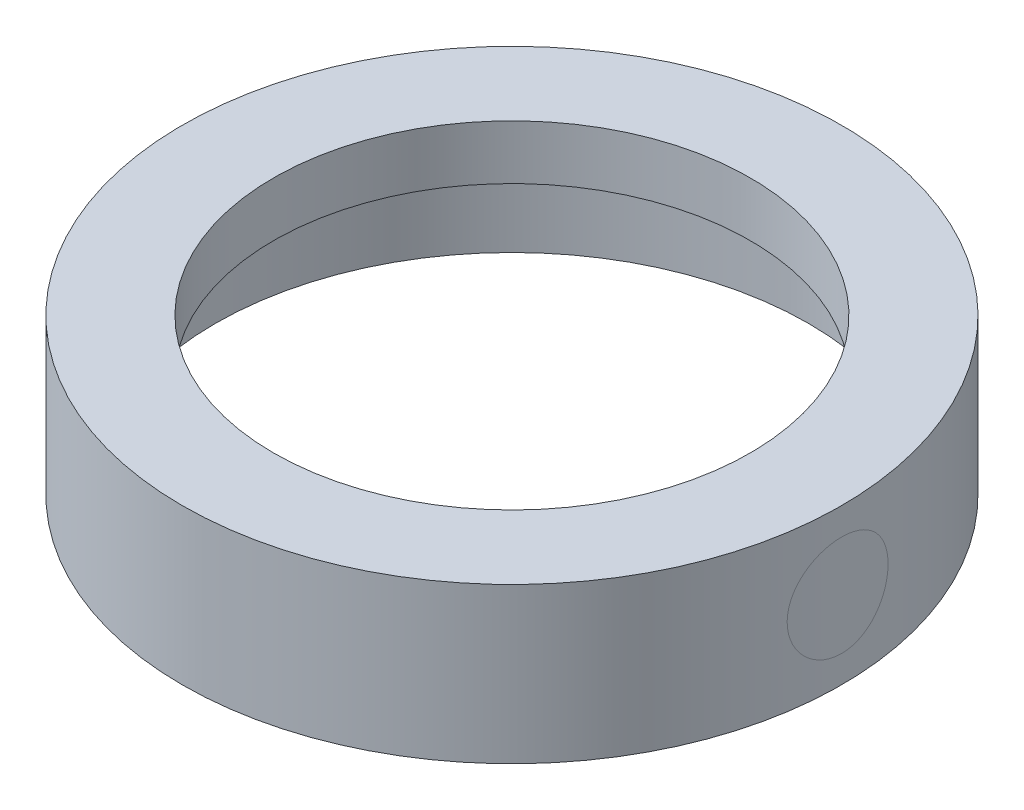
ISO-10303-21;
HEADER;
FILE_DESCRIPTION(('STEP AP214'),'2;1');
FILE_NAME('part.step','',(''),(''),'','','');
FILE_SCHEMA(('AUTOMOTIVE_DESIGN { 1 0 10303 214 1 1 1 1 }'));
ENDSEC;
DATA;
#1=APPLICATION_CONTEXT('core data for automotive mechanical design processes');
#2=APPLICATION_PROTOCOL_DEFINITION('international standard','automotive_design',2000,#1);
#3=PRODUCT_CONTEXT('',#1,'mechanical');
#4=PRODUCT('Part','Part','',(#3));
#5=PRODUCT_RELATED_PRODUCT_CATEGORY('part','',(#4));
#6=PRODUCT_DEFINITION_FORMATION('','',#4);
#7=PRODUCT_DEFINITION_CONTEXT('part definition',#1,'design');
#8=PRODUCT_DEFINITION('design','',#6,#7);
#9=PRODUCT_DEFINITION_SHAPE('','',#8);
#10=(LENGTH_UNIT() NAMED_UNIT(*) SI_UNIT(.MILLI.,.METRE.));
#11=(NAMED_UNIT(*) PLANE_ANGLE_UNIT() SI_UNIT($,.RADIAN.));
#12=(NAMED_UNIT(*) SI_UNIT($,.STERADIAN.) SOLID_ANGLE_UNIT());
#13=UNCERTAINTY_MEASURE_WITH_UNIT(LENGTH_MEASURE(1.E-05),#10,'distance_accuracy_value','');
#14=(GEOMETRIC_REPRESENTATION_CONTEXT(3) GLOBAL_UNCERTAINTY_ASSIGNED_CONTEXT((#13)) GLOBAL_UNIT_ASSIGNED_CONTEXT((#10,
#11,#12)) REPRESENTATION_CONTEXT('',''));
#15=CARTESIAN_POINT('',(0.,0.,0.));
#16=DIRECTION('',(0.,0.,1.));
#17=DIRECTION('',(1.,0.,0.));
#18=AXIS2_PLACEMENT_3D('',#15,#16,#17);
#19=CARTESIAN_POINT('',(0.,3.98145,0.));
#20=DIRECTION('',(0.,1.,0.));
#21=DIRECTION('',(0.,0.,1.));
#22=AXIS2_PLACEMENT_3D('',#19,#20,#21);
#23=CYLINDRICAL_SURFACE('',#22,15.367);
#24=CARTESIAN_POINT('',(15.185835813164,0.,-2.352675));
#25=CARTESIAN_POINT('',(15.1858380429769,-0.131317226519423,-2.35266960067987));
#26=CARTESIAN_POINT('',(15.1875575679045,-0.262709877258928,-2.34164338166575));
#27=CARTESIAN_POINT('',(15.1942449338306,-0.521819256900588,-2.29784287316508));
#28=CARTESIAN_POINT('',(15.1992159123367,-0.649532310752176,-2.26504757703732));
#29=CARTESIAN_POINT('',(15.2118302638676,-0.897494564668533,-2.17871507273392));
#30=CARTESIAN_POINT('',(15.2194715530552,-1.01774949893183,-2.12519403484746));
#31=CARTESIAN_POINT('',(15.2365630739185,-1.24755573741111,-1.99896779610506));
#32=CARTESIAN_POINT('',(15.2460130646509,-1.35710846437135,-1.92626515000783));
#33=CARTESIAN_POINT('',(15.2657452737289,-1.56332992259744,-1.76309240744842));
#34=CARTESIAN_POINT('',(15.2760331714406,-1.65989650851769,-1.67249388772129));
#35=CARTESIAN_POINT('',(15.2962313606782,-1.83651897527497,-1.47637851161808));
#36=CARTESIAN_POINT('',(15.306141631135,-1.91657393596616,-1.3708608243913));
#37=CARTESIAN_POINT('',(15.324527493462,-2.05827875844475,-1.14724661934941));
#38=CARTESIAN_POINT('',(15.3329956466582,-2.11983437393442,-1.02908971368307));
#39=CARTESIAN_POINT('',(15.347480185442,-2.22218818486969,-0.783962608125336));
#40=CARTESIAN_POINT('',(15.3534967058709,-2.26298752195318,-0.656992893393158));
#41=CARTESIAN_POINT('',(15.3623600090171,-2.3223604785304,-0.398896976207315));
#42=CARTESIAN_POINT('',(15.3652311895685,-2.34110525661952,-0.267810998880129));
#43=CARTESIAN_POINT('',(15.3675639644876,-2.35636859675936,-0.0043250324476952));
#44=CARTESIAN_POINT('',(15.3670257559293,-2.35288844348532,0.128074880265991));
#45=CARTESIAN_POINT('',(15.3626198559888,-2.32393549774011,0.389262175451393));
#46=CARTESIAN_POINT('',(15.3587800441123,-2.29864685592987,0.518070508404816));
#47=CARTESIAN_POINT('',(15.348233441568,-2.22708400545943,0.769593575449626));
#48=CARTESIAN_POINT('',(15.3415265746233,-2.18080923846976,0.892308147321979));
#49=CARTESIAN_POINT('',(15.3259516076668,-2.06840017244275,1.128715918618));
#50=CARTESIAN_POINT('',(15.3170751287562,-2.00218864334317,1.24237182158406));
#51=CARTESIAN_POINT('',(15.2981496686596,-1.85184197548449,1.45702933644741));
#52=CARTESIAN_POINT('',(15.2881006071443,-1.76770560843274,1.55803008040116));
#53=CARTESIAN_POINT('',(15.2678286164191,-1.58287252151248,1.74559619851173));
#54=CARTESIAN_POINT('',(15.2576049606436,-1.48201499071502,1.83200310232341));
#55=CARTESIAN_POINT('',(15.2382363145809,-1.26714809881561,1.98669051325555));
#56=CARTESIAN_POINT('',(15.2290913314733,-1.15313865018478,2.0549708997301));
#57=CARTESIAN_POINT('',(15.2129155455708,-0.915035738541728,2.17149018842521));
#58=CARTESIAN_POINT('',(15.2058865148852,-0.790933933043619,2.21971230468349));
#59=CARTESIAN_POINT('',(15.19476945959,-0.536260954206485,2.29458413598097));
#60=CARTESIAN_POINT('',(15.1906812185996,-0.405690257598812,2.32123543820057));
#61=CARTESIAN_POINT('',(15.1859498169002,-0.143197271314022,2.35199073689715));
#62=CARTESIAN_POINT('',(15.1852722996887,-0.0113019264259799,2.35631959998904));
#63=CARTESIAN_POINT('',(15.1873477890073,0.251330326699999,2.34290427099471));
#64=CARTESIAN_POINT('',(15.1901006844844,0.382067272300802,2.32516079345625));
#65=CARTESIAN_POINT('',(15.1986952239793,0.637971795447607,2.26829535358273));
#66=CARTESIAN_POINT('',(15.2045206142662,0.763164957465435,2.22928585397697));
#67=CARTESIAN_POINT('',(15.2185903219059,1.00523591256296,2.13111286467415));
#68=CARTESIAN_POINT('',(15.2268347632859,1.12211327890134,2.07194834158308));
#69=CARTESIAN_POINT('',(15.2448943749283,1.34524164721115,1.93460620543877));
#70=CARTESIAN_POINT('',(15.2547213430912,1.45140223980099,1.85628329010571));
#71=CARTESIAN_POINT('',(15.2748034076446,1.6491532138721,1.68304920365968));
#72=CARTESIAN_POINT('',(15.2850585292613,1.74074273531177,1.58813705407862));
#73=CARTESIAN_POINT('',(15.3049490145171,1.90756166381185,1.3834273332545));
#74=CARTESIAN_POINT('',(15.3145782133269,1.98264187913811,1.27350749705075));
#75=CARTESIAN_POINT('',(15.3320355593614,2.11327051596323,1.04248479012309));
#76=CARTESIAN_POINT('',(15.3398637575181,2.16881948982558,0.921382235780205));
#77=CARTESIAN_POINT('',(15.352810103632,2.25857153697538,0.671893504627777));
#78=CARTESIAN_POINT('',(15.3579385170057,2.2928555561827,0.543537002874031));
#79=CARTESIAN_POINT('',(15.3649506069629,2.33936623728937,0.282804257714095));
#80=CARTESIAN_POINT('',(15.366834507191,2.35159441950336,0.150428292010259));
#81=CARTESIAN_POINT('',(15.3671429012579,2.35360802079699,-0.113139982287013));
#82=CARTESIAN_POINT('',(15.3656025467778,2.34362148435485,-0.24433056437077));
#83=CARTESIAN_POINT('',(15.3593065446846,2.30197872449315,-0.503143396417296));
#84=CARTESIAN_POINT('',(15.3545509086398,2.27032257903992,-0.630765659217008));
#85=CARTESIAN_POINT('',(15.3423562985326,2.18632130717684,-0.878752112138238));
#86=CARTESIAN_POINT('',(15.3349194568356,2.13399261850357,-0.999121981557647));
#87=CARTESIAN_POINT('',(15.3181783745126,2.01015618109243,-1.22940877870968));
#88=CARTESIAN_POINT('',(15.3088740681948,1.93864775763959,-1.33932533852589));
#89=CARTESIAN_POINT('',(15.2893183668206,1.77765997661353,-1.54674068069667));
#90=CARTESIAN_POINT('',(15.2790586350212,1.68801247905064,-1.64410818567531));
#91=CARTESIAN_POINT('',(15.2588093651368,1.49364504599507,-1.8225002456294));
#92=CARTESIAN_POINT('',(15.2488198909899,1.38892158021562,-1.90352096203305));
#93=CARTESIAN_POINT('',(15.2301791978254,1.16665044172464,-2.04734867885495));
#94=CARTESIAN_POINT('',(15.2215361807831,1.04903108174843,-2.11004594391973));
#95=CARTESIAN_POINT('',(15.2066632813138,0.804852743826474,-2.21470068917086));
#96=CARTESIAN_POINT('',(15.200430912644,0.678303136357985,-2.25667954986252));
#97=CARTESIAN_POINT('',(15.1925146270749,0.459331874061138,-2.30925157592465));
#98=CARTESIAN_POINT('',(15.1900234652318,0.368258147374492,-2.32551023132472));
#99=CARTESIAN_POINT('',(15.1866832849588,0.184802054767488,-2.34722376873507));
#100=CARTESIAN_POINT('',(15.1858342438448,0.0924197069420707,-2.35267879998571));
#101=CARTESIAN_POINT('',(15.185835813164,0.,-2.352675));
#102=B_SPLINE_CURVE_WITH_KNOTS('',3,(#24,#25,#26,#27,#28,#29,#30,#31,#32,#33,#34,#35,#36,#37,
#38,#39,#40,#41,#42,#43,#44,#45,#46,#47,#48,#49,#50,#51,#52,#53,#54,#55,#56,#57,#58,#59,#60,#61,
#62,#63,#64,#65,#66,#67,#68,#69,#70,#71,#72,#73,#74,#75,#76,#77,#78,#79,#80,#81,#82,#83,#84,#85,
#86,#87,#88,#89,#90,#91,#92,#93,#94,#95,#96,#97,#98,#99,#100,#101),.UNSPECIFIED.,.T.,.F.,(4,2,2,
2,2,2,2,2,2,2,2,2,2,2,2,2,2,2,2,2,2,2,2,2,2,2,2,2,2,2,2,2,2,2,2,2,2,2,4),(0.,0.3936138475549,
0.787608076350895,1.18129552692755,1.57493056953332,1.97150033879375,2.36809220179008,
2.76667155504359,3.16522898324421,3.56067249007626,3.95609313916009,4.34820719346334,
4.7403316804535,5.1339951412242,5.52768558631436,5.92540888768973,6.32313483615336,
6.7211929591142,7.11922179029687,7.51323310688259,7.90723166847412,8.29916654956429,
8.6911215290749,9.08614675344485,9.48119528510438,9.87967911790611,10.2781516802707,
10.6750979791437,11.0720169153586,11.4648801153055,11.8577419017547,12.2502919315743,
12.6428557725406,13.0392405077671,13.435718214461,13.834523847672,14.2329170655306,
14.509942250514,14.7869636086676),.UNSPECIFIED.);
#103=CARTESIAN_POINT('',(15.185835813164,0.,-2.352675));
#104=VERTEX_POINT('',#103);
#105=EDGE_CURVE('E10',#104,#104,#102,.T.);
#106=ORIENTED_EDGE('',*,*,#105,.F.);
#107=EDGE_LOOP('',(#106));
#108=FACE_BOUND('',#107,.T.);
#109=ADVANCED_FACE('F36',(#108),#23,.T.);
#110=CARTESIAN_POINT('',(0.,3.6195,-11.1125));
#111=DIRECTION('',(0.,-1.,0.));
#112=DIRECTION('',(0.,0.,-1.));
#113=AXIS2_PLACEMENT_3D('',#110,#111,#112);
#114=PLANE('',#113);
#115=CARTESIAN_POINT('',(0.,3.6195,0.));
#116=DIRECTION('',(0.,1.,0.));
#117=DIRECTION('',(0.,0.,1.));
#118=AXIS2_PLACEMENT_3D('',#115,#116,#117);
#119=CIRCLE('',#118,11.1125);
#120=CARTESIAN_POINT('',(0.,3.6195,11.1125));
#121=VERTEX_POINT('',#120);
#122=EDGE_CURVE('E68',#121,#121,#119,.T.);
#123=ORIENTED_EDGE('',*,*,#122,.F.);
#124=EDGE_LOOP('',(#123));
#125=FACE_BOUND('',#124,.T.);
#126=CARTESIAN_POINT('',(0.,3.6195,0.));
#127=DIRECTION('',(0.,1.,0.));
#128=DIRECTION('',(0.,0.,1.));
#129=AXIS2_PLACEMENT_3D('',#126,#127,#128);
#130=CIRCLE('',#129,15.367);
#131=CARTESIAN_POINT('',(0.,3.6195,15.367));
#132=VERTEX_POINT('',#131);
#133=EDGE_CURVE('E47',#132,#132,#130,.T.);
#134=ORIENTED_EDGE('',*,*,#133,.T.);
#135=EDGE_LOOP('',(#134));
#136=FACE_BOUND('',#135,.T.);
#137=ADVANCED_FACE('F74',(#125,#136),#114,.F.);
#138=ORIENTED_EDGE('',*,*,#105,.T.);
#139=EDGE_LOOP('',(#138));
#140=FACE_BOUND('',#139,.T.);
#141=ORIENTED_EDGE('',*,*,#133,.F.);
#142=EDGE_LOOP('',(#141));
#143=FACE_BOUND('',#142,.T.);
#144=CARTESIAN_POINT('',(0.,-3.6195,0.));
#145=DIRECTION('',(0.,1.,0.));
#146=DIRECTION('',(0.,0.,1.));
#147=AXIS2_PLACEMENT_3D('',#144,#145,#146);
#148=CIRCLE('',#147,15.367);
#149=CARTESIAN_POINT('',(0.,-3.6195,15.367));
#150=VERTEX_POINT('',#149);
#151=EDGE_CURVE('E53',#150,#150,#148,.T.);
#152=ORIENTED_EDGE('',*,*,#151,.T.);
#153=EDGE_LOOP('',(#152));
#154=FACE_BOUND('',#153,.T.);
#155=ADVANCED_FACE('F76',(#140,#143,#154),#23,.T.);
#156=CARTESIAN_POINT('',(0.,-3.6195,-15.367));
#157=DIRECTION('',(0.,1.,0.));
#158=DIRECTION('',(0.,0.,1.));
#159=AXIS2_PLACEMENT_3D('',#156,#157,#158);
#160=PLANE('',#159);
#161=ORIENTED_EDGE('',*,*,#151,.F.);
#162=EDGE_LOOP('',(#161));
#163=FACE_BOUND('',#162,.T.);
#164=CARTESIAN_POINT('',(0.,-3.6195,0.));
#165=DIRECTION('',(0.,1.,0.));
#166=DIRECTION('',(0.,0.,1.));
#167=AXIS2_PLACEMENT_3D('',#164,#165,#166);
#168=CIRCLE('',#167,13.8303);
#169=CARTESIAN_POINT('',(0.,-3.6195,13.8303));
#170=VERTEX_POINT('',#169);
#171=EDGE_CURVE('E57',#170,#170,#168,.T.);
#172=ORIENTED_EDGE('',*,*,#171,.T.);
#173=EDGE_LOOP('',(#172));
#174=FACE_BOUND('',#173,.T.);
#175=ADVANCED_FACE('F82',(#163,#174),#160,.F.);
#176=CARTESIAN_POINT('',(0.,3.98145,0.));
#177=DIRECTION('',(0.,1.,0.));
#178=DIRECTION('',(0.,0.,1.));
#179=AXIS2_PLACEMENT_3D('',#176,#177,#178);
#180=CYLINDRICAL_SURFACE('',#179,13.8303);
#181=ORIENTED_EDGE('',*,*,#171,.F.);
#182=EDGE_LOOP('',(#181));
#183=FACE_BOUND('',#182,.T.);
#184=CARTESIAN_POINT('',(0.,1.08585,0.));
#185=DIRECTION('',(0.,1.,0.));
#186=DIRECTION('',(0.,0.,1.));
#187=AXIS2_PLACEMENT_3D('',#184,#185,#186);
#188=CIRCLE('',#187,13.8303);
#189=CARTESIAN_POINT('',(0.,1.08585,13.8303));
#190=VERTEX_POINT('',#189);
#191=EDGE_CURVE('E62',#190,#190,#188,.T.);
#192=ORIENTED_EDGE('',*,*,#191,.T.);
#193=EDGE_LOOP('',(#192));
#194=FACE_BOUND('',#193,.T.);
#195=ADVANCED_FACE('F88',(#183,#194),#180,.F.);
#196=CARTESIAN_POINT('',(0.,1.08585,-13.8303));
#197=DIRECTION('',(0.,1.,0.));
#198=DIRECTION('',(0.,0.,1.));
#199=AXIS2_PLACEMENT_3D('',#196,#197,#198);
#200=PLANE('',#199);
#201=ORIENTED_EDGE('',*,*,#191,.F.);
#202=EDGE_LOOP('',(#201));
#203=FACE_BOUND('',#202,.T.);
#204=CARTESIAN_POINT('',(0.,1.08585,0.));
#205=DIRECTION('',(0.,1.,0.));
#206=DIRECTION('',(0.,0.,1.));
#207=AXIS2_PLACEMENT_3D('',#204,#205,#206);
#208=CIRCLE('',#207,11.1125);
#209=CARTESIAN_POINT('',(0.,1.08585,11.1125));
#210=VERTEX_POINT('',#209);
#211=EDGE_CURVE('E65',#210,#210,#208,.T.);
#212=ORIENTED_EDGE('',*,*,#211,.T.);
#213=EDGE_LOOP('',(#212));
#214=FACE_BOUND('',#213,.T.);
#215=ADVANCED_FACE('F92',(#203,#214),#200,.F.);
#216=CARTESIAN_POINT('',(0.,3.98145,0.));
#217=DIRECTION('',(0.,1.,0.));
#218=DIRECTION('',(0.,0.,1.));
#219=AXIS2_PLACEMENT_3D('',#216,#217,#218);
#220=CYLINDRICAL_SURFACE('',#219,11.1125);
#221=ORIENTED_EDGE('',*,*,#211,.F.);
#222=EDGE_LOOP('',(#221));
#223=FACE_BOUND('',#222,.T.);
#224=ORIENTED_EDGE('',*,*,#122,.T.);
#225=EDGE_LOOP('',(#224));
#226=FACE_BOUND('',#225,.T.);
#227=ADVANCED_FACE('F72',(#223,#226),#220,.F.);
#228=CLOSED_SHELL('',(#109,#137,#155,#175,#195,#215,#227));
#229=MANIFOLD_SOLID_BREP('B2',#228);
#230=ADVANCED_BREP_SHAPE_REPRESENTATION('',(#18,#229),#14);
#231=SHAPE_DEFINITION_REPRESENTATION(#9,#230);
ENDSEC;
END-ISO-10303-21;
